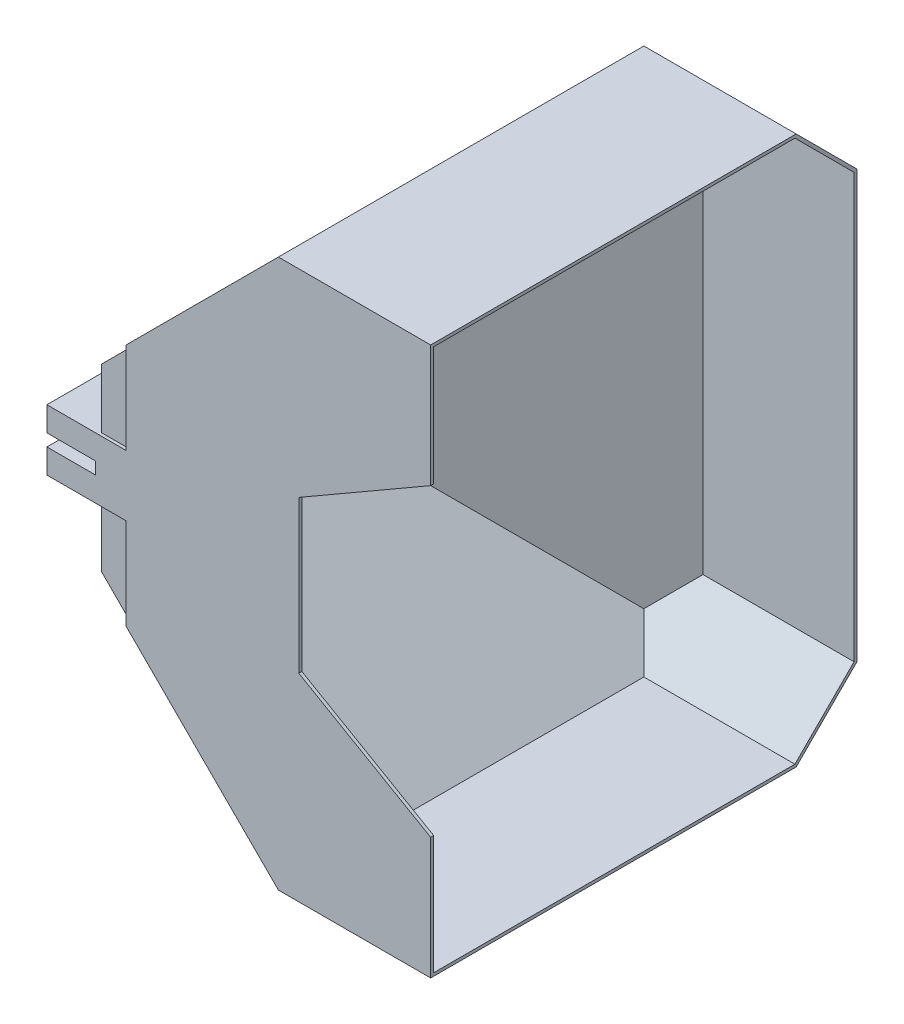
ISO-10303-21;
HEADER;
FILE_DESCRIPTION(('STEP AP214'),'2;1');
FILE_NAME('part.step','',(''),(''),'','','');
FILE_SCHEMA(('AUTOMOTIVE_DESIGN { 1 0 10303 214 1 1 1 1 }'));
ENDSEC;
DATA;
#1=APPLICATION_CONTEXT('core data for automotive mechanical design processes');
#2=APPLICATION_PROTOCOL_DEFINITION('international standard','automotive_design',2000,#1);
#3=PRODUCT_CONTEXT('',#1,'mechanical');
#4=PRODUCT('Part','Part','',(#3));
#5=PRODUCT_RELATED_PRODUCT_CATEGORY('part','',(#4));
#6=PRODUCT_DEFINITION_FORMATION('','',#4);
#7=PRODUCT_DEFINITION_CONTEXT('part definition',#1,'design');
#8=PRODUCT_DEFINITION('design','',#6,#7);
#9=PRODUCT_DEFINITION_SHAPE('','',#8);
#10=(LENGTH_UNIT() NAMED_UNIT(*) SI_UNIT(.MILLI.,.METRE.));
#11=(NAMED_UNIT(*) PLANE_ANGLE_UNIT() SI_UNIT($,.RADIAN.));
#12=(NAMED_UNIT(*) SI_UNIT($,.STERADIAN.) SOLID_ANGLE_UNIT());
#13=UNCERTAINTY_MEASURE_WITH_UNIT(LENGTH_MEASURE(1.E-05),#10,'distance_accuracy_value','');
#14=(GEOMETRIC_REPRESENTATION_CONTEXT(3) GLOBAL_UNCERTAINTY_ASSIGNED_CONTEXT((#13)) GLOBAL_UNIT_ASSIGNED_CONTEXT((#10,
#11,#12)) REPRESENTATION_CONTEXT('',''));
#15=CARTESIAN_POINT('',(0.,0.,0.));
#16=DIRECTION('',(0.,0.,1.));
#17=DIRECTION('',(1.,0.,0.));
#18=AXIS2_PLACEMENT_3D('',#15,#16,#17);
#19=CARTESIAN_POINT('',(-35.5,0.,0.));
#20=DIRECTION('',(-1.,0.,0.));
#21=DIRECTION('',(0.,0.,1.));
#22=AXIS2_PLACEMENT_3D('',#19,#20,#21);
#23=PLANE('',#22);
#24=DIRECTION('',(0.,0.,-1.));
#25=VECTOR('',#24,1.);
#26=CARTESIAN_POINT('',(-35.5,46.,50.));
#27=LINE('',#26,#25);
#28=CARTESIAN_POINT('',(-35.5,46.,35.));
#29=VERTEX_POINT('',#28);
#30=CARTESIAN_POINT('',(-35.5,46.,20.));
#31=VERTEX_POINT('',#30);
#32=EDGE_CURVE('E626',#29,#31,#27,.T.);
#33=ORIENTED_EDGE('',*,*,#32,.F.);
#34=DIRECTION('',(0.,1.,0.));
#35=VECTOR('',#34,1.);
#36=CARTESIAN_POINT('',(-35.5,0.,35.));
#37=LINE('',#36,#35);
#38=CARTESIAN_POINT('',(-35.5,50.,35.));
#39=VERTEX_POINT('',#38);
#40=EDGE_CURVE('E666',#29,#39,#37,.T.);
#41=ORIENTED_EDGE('',*,*,#40,.T.);
#42=DIRECTION('',(0.,0.,1.));
#43=VECTOR('',#42,1.);
#44=CARTESIAN_POINT('',(-35.5,50.,0.));
#45=LINE('',#44,#43);
#46=CARTESIAN_POINT('',(-35.5,50.,20.));
#47=VERTEX_POINT('',#46);
#48=EDGE_CURVE('E656',#47,#39,#45,.T.);
#49=ORIENTED_EDGE('',*,*,#48,.F.);
#50=DIRECTION('',(0.,1.,0.));
#51=VECTOR('',#50,1.);
#52=CARTESIAN_POINT('',(-35.5,0.,20.));
#53=LINE('',#52,#51);
#54=EDGE_CURVE('E381',#47,#31,#53,.F.);
#55=ORIENTED_EDGE('',*,*,#54,.T.);
#56=EDGE_LOOP('',(#33,#41,#49,#55));
#57=FACE_BOUND('',#56,.T.);
#58=ADVANCED_FACE('F47',(#57),#23,.T.);
#59=CARTESIAN_POINT('',(27.5,90.,-35.));
#60=DIRECTION('',(-1.,0.,0.));
#61=DIRECTION('',(0.,0.,1.));
#62=AXIS2_PLACEMENT_3D('',#59,#60,#61);
#63=PLANE('',#62);
#64=DIRECTION('',(0.,-1.,0.));
#65=VECTOR('',#64,1.);
#66=CARTESIAN_POINT('',(27.5,90.,34.5));
#67=LINE('',#66,#65);
#68=CARTESIAN_POINT('',(27.5,20.,34.5));
#69=VERTEX_POINT('',#68);
#70=CARTESIAN_POINT('',(27.5,0.5,34.5));
#71=VERTEX_POINT('',#70);
#72=EDGE_CURVE('E282',#69,#71,#67,.T.);
#73=ORIENTED_EDGE('',*,*,#72,.F.);
#74=DIRECTION('',(0.,0.,-1.));
#75=VECTOR('',#74,1.);
#76=CARTESIAN_POINT('',(27.5,20.,39.5));
#77=LINE('',#76,#75);
#78=CARTESIAN_POINT('',(27.5,20.,35.));
#79=VERTEX_POINT('',#78);
#80=EDGE_CURVE('E64',#79,#69,#77,.T.);
#81=ORIENTED_EDGE('',*,*,#80,.F.);
#82=DIRECTION('',(0.,-1.,0.));
#83=VECTOR('',#82,1.);
#84=CARTESIAN_POINT('',(27.5,90.,35.));
#85=LINE('',#84,#83);
#86=CARTESIAN_POINT('',(27.5,0.,35.));
#87=VERTEX_POINT('',#86);
#88=EDGE_CURVE('E279',#79,#87,#85,.T.);
#89=ORIENTED_EDGE('',*,*,#88,.T.);
#90=DIRECTION('',(0.,0.,-1.));
#91=VECTOR('',#90,1.);
#92=CARTESIAN_POINT('',(27.5,0.,-35.));
#93=LINE('',#92,#91);
#94=CARTESIAN_POINT('',(27.5,0.,-25.));
#95=VERTEX_POINT('',#94);
#96=EDGE_CURVE('E467',#87,#95,#93,.T.);
#97=ORIENTED_EDGE('',*,*,#96,.T.);
#98=DIRECTION('',(0.,-0.707106781186547,0.707106781186548));
#99=VECTOR('',#98,1.);
#100=CARTESIAN_POINT('',(27.5,10.,-35.));
#101=LINE('',#100,#99);
#102=CARTESIAN_POINT('',(27.5,10.,-35.));
#103=VERTEX_POINT('',#102);
#104=EDGE_CURVE('E361',#95,#103,#101,.F.);
#105=ORIENTED_EDGE('',*,*,#104,.T.);
#106=DIRECTION('',(0.,-1.,0.));
#107=VECTOR('',#106,1.);
#108=CARTESIAN_POINT('',(27.5,90.,-35.));
#109=LINE('',#108,#107);
#110=CARTESIAN_POINT('',(27.5,80.,-35.));
#111=VERTEX_POINT('',#110);
#112=EDGE_CURVE('E297',#111,#103,#109,.T.);
#113=ORIENTED_EDGE('',*,*,#112,.F.);
#114=DIRECTION('',(0.,0.707106781186548,0.707106781186547));
#115=VECTOR('',#114,1.);
#116=CARTESIAN_POINT('',(27.5,90.,-25.));
#117=LINE('',#116,#115);
#118=CARTESIAN_POINT('',(27.5,90.,-25.));
#119=VERTEX_POINT('',#118);
#120=EDGE_CURVE('E364',#111,#119,#117,.T.);
#121=ORIENTED_EDGE('',*,*,#120,.T.);
#122=DIRECTION('',(0.,0.,-1.));
#123=VECTOR('',#122,1.);
#124=CARTESIAN_POINT('',(27.5,90.,-35.));
#125=LINE('',#124,#123);
#126=CARTESIAN_POINT('',(27.5,90.,35.));
#127=VERTEX_POINT('',#126);
#128=EDGE_CURVE('E298',#127,#119,#125,.T.);
#129=ORIENTED_EDGE('',*,*,#128,.F.);
#130=CARTESIAN_POINT('',(27.5,70.,35.));
#131=VERTEX_POINT('',#130);
#132=EDGE_CURVE('E291',#127,#131,#85,.T.);
#133=ORIENTED_EDGE('',*,*,#132,.T.);
#134=DIRECTION('',(0.,0.,-1.));
#135=VECTOR('',#134,1.);
#136=CARTESIAN_POINT('',(27.5,70.,39.5));
#137=LINE('',#136,#135);
#138=CARTESIAN_POINT('',(27.5,70.,34.5));
#139=VERTEX_POINT('',#138);
#140=EDGE_CURVE('E284',#131,#139,#137,.T.);
#141=ORIENTED_EDGE('',*,*,#140,.T.);
#142=CARTESIAN_POINT('',(27.5,89.5,34.5));
#143=VERTEX_POINT('',#142);
#144=EDGE_CURVE('E437',#143,#139,#67,.T.);
#145=ORIENTED_EDGE('',*,*,#144,.F.);
#146=DIRECTION('',(0.,0.,-1.));
#147=VECTOR('',#146,1.);
#148=CARTESIAN_POINT('',(27.5,89.5,-35.));
#149=LINE('',#148,#147);
#150=CARTESIAN_POINT('',(27.5,89.5,-24.7928932188135));
#151=VERTEX_POINT('',#150);
#152=EDGE_CURVE('E453',#143,#151,#149,.T.);
#153=ORIENTED_EDGE('',*,*,#152,.T.);
#154=DIRECTION('',(0.,0.707106781186548,0.707106781186547));
#155=VECTOR('',#154,1.);
#156=CARTESIAN_POINT('',(27.5,89.6464466094067,-24.6464466094067));
#157=LINE('',#156,#155);
#158=CARTESIAN_POINT('',(27.5,79.7928932188134,-34.5));
#159=VERTEX_POINT('',#158);
#160=EDGE_CURVE('E463',#159,#151,#157,.T.);
#161=ORIENTED_EDGE('',*,*,#160,.F.);
#162=DIRECTION('',(0.,-1.,0.));
#163=VECTOR('',#162,1.);
#164=CARTESIAN_POINT('',(27.5,90.,-34.5));
#165=LINE('',#164,#163);
#166=CARTESIAN_POINT('',(27.5,10.2071067811865,-34.5));
#167=VERTEX_POINT('',#166);
#168=EDGE_CURVE('E449',#159,#167,#165,.T.);
#169=ORIENTED_EDGE('',*,*,#168,.T.);
#170=DIRECTION('',(0.,-0.707106781186547,0.707106781186548));
#171=VECTOR('',#170,1.);
#172=CARTESIAN_POINT('',(27.5,10.3535533905933,-34.6464466094067));
#173=LINE('',#172,#171);
#174=CARTESIAN_POINT('',(27.5,0.5,-24.7928932188134));
#175=VERTEX_POINT('',#174);
#176=EDGE_CURVE('E460',#175,#167,#173,.F.);
#177=ORIENTED_EDGE('',*,*,#176,.F.);
#178=DIRECTION('',(0.,0.,-1.));
#179=VECTOR('',#178,1.);
#180=CARTESIAN_POINT('',(27.5,0.5,-35.));
#181=LINE('',#180,#179);
#182=EDGE_CURVE('E455',#71,#175,#181,.T.);
#183=ORIENTED_EDGE('',*,*,#182,.F.);
#184=EDGE_LOOP('',(#73,#81,#89,#97,#105,#113,#121,#129,#133,#141,#145,#153,#161,#169,#177,#183));
#185=FACE_BOUND('',#184,.T.);
#186=ADVANCED_FACE('F277',(#185),#63,.F.);
#187=CARTESIAN_POINT('',(-27.5,90.,-35.));
#188=DIRECTION('',(0.,0.,1.));
#189=DIRECTION('',(1.,0.,0.));
#190=AXIS2_PLACEMENT_3D('',#187,#188,#189);
#191=PLANE('',#190);
#192=DIRECTION('',(0.,1.,0.));
#193=VECTOR('',#192,1.);
#194=CARTESIAN_POINT('',(2.50000000000008,90.,-35.));
#195=LINE('',#194,#193);
#196=CARTESIAN_POINT('',(2.50000000000008,9.99999999999999,-35.));
#197=VERTEX_POINT('',#196);
#198=CARTESIAN_POINT('',(2.50000000000008,80.,-35.));
#199=VERTEX_POINT('',#198);
#200=EDGE_CURVE('E310',#197,#199,#195,.T.);
#201=ORIENTED_EDGE('',*,*,#200,.T.);
#202=DIRECTION('',(1.,0.,0.));
#203=VECTOR('',#202,1.);
#204=CARTESIAN_POINT('',(27.5,80.,-35.));
#205=LINE('',#204,#203);
#206=EDGE_CURVE('E358',#199,#111,#205,.T.);
#207=ORIENTED_EDGE('',*,*,#206,.T.);
#208=ORIENTED_EDGE('',*,*,#112,.T.);
#209=DIRECTION('',(-1.,0.,0.));
#210=VECTOR('',#209,1.);
#211=CARTESIAN_POINT('',(-27.5,9.99999999999999,-35.));
#212=LINE('',#211,#210);
#213=EDGE_CURVE('E354',#103,#197,#212,.T.);
#214=ORIENTED_EDGE('',*,*,#213,.T.);
#215=EDGE_LOOP('',(#201,#207,#208,#214));
#216=FACE_BOUND('',#215,.T.);
#217=ADVANCED_FACE('F598',(#216),#191,.F.);
#218=CARTESIAN_POINT('',(-27.5,90.,-35.));
#219=DIRECTION('',(1.,0.,0.));
#220=DIRECTION('',(0.,0.,-1.));
#221=AXIS2_PLACEMENT_3D('',#218,#219,#220);
#222=PLANE('',#221);
#223=DIRECTION('',(0.,0.,1.));
#224=VECTOR('',#223,1.);
#225=CARTESIAN_POINT('',(-27.5,30.,-35.));
#226=LINE('',#225,#224);
#227=CARTESIAN_POINT('',(-27.5,30.,-5.00000000000002));
#228=VERTEX_POINT('',#227);
#229=CARTESIAN_POINT('',(-27.5,30.,29.9999999999999));
#230=VERTEX_POINT('',#229);
#231=EDGE_CURVE('E317',#228,#230,#226,.T.);
#232=ORIENTED_EDGE('',*,*,#231,.T.);
#233=DIRECTION('',(0.,1.,0.));
#234=VECTOR('',#233,1.);
#235=CARTESIAN_POINT('',(-27.5,90.,29.9999999999999));
#236=LINE('',#235,#234);
#237=CARTESIAN_POINT('',(-27.5,40.,29.9999999999999));
#238=VERTEX_POINT('',#237);
#239=EDGE_CURVE('E72',#230,#238,#236,.T.);
#240=ORIENTED_EDGE('',*,*,#239,.T.);
#241=DIRECTION('',(0.,0.,1.));
#242=VECTOR('',#241,1.);
#243=CARTESIAN_POINT('',(-27.5,40.,0.));
#244=LINE('',#243,#242);
#245=CARTESIAN_POINT('',(-27.5,40.,15.));
#246=VERTEX_POINT('',#245);
#247=EDGE_CURVE('E653',#246,#238,#244,.T.);
#248=ORIENTED_EDGE('',*,*,#247,.F.);
#249=DIRECTION('',(0.,1.,0.));
#250=VECTOR('',#249,1.);
#251=CARTESIAN_POINT('',(-27.5,0.,15.));
#252=LINE('',#251,#250);
#253=CARTESIAN_POINT('',(-27.5,50.,15.));
#254=VERTEX_POINT('',#253);
#255=EDGE_CURVE('E643',#246,#254,#252,.T.);
#256=ORIENTED_EDGE('',*,*,#255,.T.);
#257=DIRECTION('',(0.,0.,1.));
#258=VECTOR('',#257,1.);
#259=CARTESIAN_POINT('',(-27.5,50.,0.));
#260=LINE('',#259,#258);
#261=CARTESIAN_POINT('',(-27.5,50.,29.9999999999999));
#262=VERTEX_POINT('',#261);
#263=EDGE_CURVE('E659',#254,#262,#260,.T.);
#264=ORIENTED_EDGE('',*,*,#263,.T.);
#265=DIRECTION('',(0.,1.,0.));
#266=VECTOR('',#265,1.);
#267=CARTESIAN_POINT('',(-27.5,90.,29.9999999999999));
#268=LINE('',#267,#266);
#269=CARTESIAN_POINT('',(-27.5,59.9999999999999,29.9999999999999));
#270=VERTEX_POINT('',#269);
#271=EDGE_CURVE('E402',#262,#270,#268,.T.);
#272=ORIENTED_EDGE('',*,*,#271,.T.);
#273=DIRECTION('',(0.,0.,-1.));
#274=VECTOR('',#273,1.);
#275=CARTESIAN_POINT('',(-27.5,59.9999999999999,-5.00000000000001));
#276=LINE('',#275,#274);
#277=CARTESIAN_POINT('',(-27.5,59.9999999999999,-5.00000000000002));
#278=VERTEX_POINT('',#277);
#279=EDGE_CURVE('E314',#270,#278,#276,.T.);
#280=ORIENTED_EDGE('',*,*,#279,.T.);
#281=DIRECTION('',(0.,-1.,0.));
#282=VECTOR('',#281,1.);
#283=CARTESIAN_POINT('',(-27.5,90.,-5.00000000000002));
#284=LINE('',#283,#282);
#285=EDGE_CURVE('E306',#278,#228,#284,.T.);
#286=ORIENTED_EDGE('',*,*,#285,.T.);
#287=EDGE_LOOP('',(#232,#240,#248,#256,#264,#272,#280,#286));
#288=FACE_BOUND('',#287,.T.);
#289=ADVANCED_FACE('F721',(#288),#222,.F.);
#290=CARTESIAN_POINT('',(-27.5,90.,35.));
#291=DIRECTION('',(0.,0.,-1.));
#292=DIRECTION('',(-1.,0.,0.));
#293=AXIS2_PLACEMENT_3D('',#290,#291,#292);
#294=PLANE('',#293);
#295=DIRECTION('',(0.,1.,0.));
#296=VECTOR('',#295,1.);
#297=CARTESIAN_POINT('',(5.84936490538906,90.,35.));
#298=LINE('',#297,#296);
#299=CARTESIAN_POINT('',(5.84936490538906,32.5,35.));
#300=VERTEX_POINT('',#299);
#301=CARTESIAN_POINT('',(5.84936490538906,57.5,35.));
#302=VERTEX_POINT('',#301);
#303=EDGE_CURVE('E272',#300,#302,#298,.T.);
#304=ORIENTED_EDGE('',*,*,#303,.T.);
#305=DIRECTION('',(0.866025403784439,0.5,0.));
#306=VECTOR('',#305,1.);
#307=CARTESIAN_POINT('',(-5.08974596215563,51.1843013959279,35.));
#308=LINE('',#307,#306);
#309=EDGE_CURVE('E431',#302,#131,#308,.T.);
#310=ORIENTED_EDGE('',*,*,#309,.T.);
#311=ORIENTED_EDGE('',*,*,#132,.F.);
#312=DIRECTION('',(1.,0.,0.));
#313=VECTOR('',#312,1.);
#314=CARTESIAN_POINT('',(-27.5,90.,35.));
#315=LINE('',#314,#313);
#316=CARTESIAN_POINT('',(2.49999999999998,90.,35.));
#317=VERTEX_POINT('',#316);
#318=EDGE_CURVE('E292',#317,#127,#315,.T.);
#319=ORIENTED_EDGE('',*,*,#318,.F.);
#320=DIRECTION('',(-0.707106781186546,-0.707106781186549,0.));
#321=VECTOR('',#320,1.);
#322=CARTESIAN_POINT('',(2.49999999999998,90.,35.));
#323=LINE('',#322,#321);
#324=CARTESIAN_POINT('',(-22.4999999999999,65.,35.));
#325=VERTEX_POINT('',#324);
#326=EDGE_CURVE('E320',#317,#325,#323,.T.);
#327=ORIENTED_EDGE('',*,*,#326,.T.);
#328=DIRECTION('',(0.,-1.,0.));
#329=VECTOR('',#328,1.);
#330=CARTESIAN_POINT('',(-22.4999999999999,90.,35.));
#331=LINE('',#330,#329);
#332=CARTESIAN_POINT('',(-22.4999999999999,50.,35.));
#333=VERTEX_POINT('',#332);
#334=EDGE_CURVE('E391',#325,#333,#331,.T.);
#335=ORIENTED_EDGE('',*,*,#334,.T.);
#336=DIRECTION('',(1.,0.,0.));
#337=VECTOR('',#336,1.);
#338=CARTESIAN_POINT('',(-35.5,50.,35.));
#339=LINE('',#338,#337);
#340=EDGE_CURVE('E648',#39,#333,#339,.T.);
#341=ORIENTED_EDGE('',*,*,#340,.F.);
#342=ORIENTED_EDGE('',*,*,#40,.F.);
#343=DIRECTION('',(1.,0.,0.));
#344=VECTOR('',#343,1.);
#345=CARTESIAN_POINT('',(-27.5,46.,35.));
#346=LINE('',#345,#344);
#347=CARTESIAN_POINT('',(-27.5,46.,35.));
#348=VERTEX_POINT('',#347);
#349=EDGE_CURVE('E663',#29,#348,#346,.T.);
#350=ORIENTED_EDGE('',*,*,#349,.T.);
#351=DIRECTION('',(0.,1.,0.));
#352=VECTOR('',#351,1.);
#353=CARTESIAN_POINT('',(-27.5,90.,35.));
#354=LINE('',#353,#352);
#355=CARTESIAN_POINT('',(-27.5,44.,35.));
#356=VERTEX_POINT('',#355);
#357=EDGE_CURVE('E388',#356,#348,#354,.T.);
#358=ORIENTED_EDGE('',*,*,#357,.F.);
#359=DIRECTION('',(-1.,0.,0.));
#360=VECTOR('',#359,1.);
#361=CARTESIAN_POINT('',(-27.5,44.,35.));
#362=LINE('',#361,#360);
#363=CARTESIAN_POINT('',(-35.5,44.,35.));
#364=VERTEX_POINT('',#363);
#365=EDGE_CURVE('E675',#356,#364,#362,.T.);
#366=ORIENTED_EDGE('',*,*,#365,.T.);
#367=CARTESIAN_POINT('',(-35.5,40.,35.));
#368=VERTEX_POINT('',#367);
#369=EDGE_CURVE('E622',#368,#364,#37,.T.);
#370=ORIENTED_EDGE('',*,*,#369,.F.);
#371=DIRECTION('',(1.,0.,0.));
#372=VECTOR('',#371,1.);
#373=CARTESIAN_POINT('',(-35.5,40.,35.));
#374=LINE('',#373,#372);
#375=CARTESIAN_POINT('',(-22.4999999999999,40.,35.));
#376=VERTEX_POINT('',#375);
#377=EDGE_CURVE('E645',#368,#376,#374,.T.);
#378=ORIENTED_EDGE('',*,*,#377,.T.);
#379=DIRECTION('',(0.,-1.,0.));
#380=VECTOR('',#379,1.);
#381=CARTESIAN_POINT('',(-22.4999999999999,90.,35.));
#382=LINE('',#381,#380);
#383=CARTESIAN_POINT('',(-22.4999999999999,25.,35.));
#384=VERTEX_POINT('',#383);
#385=EDGE_CURVE('E395',#376,#384,#382,.T.);
#386=ORIENTED_EDGE('',*,*,#385,.T.);
#387=DIRECTION('',(-0.707106781186549,0.707106781186547,0.));
#388=VECTOR('',#387,1.);
#389=CARTESIAN_POINT('',(-27.5,30.,35.));
#390=LINE('',#389,#388);
#391=CARTESIAN_POINT('',(2.50000000000009,0.,35.));
#392=VERTEX_POINT('',#391);
#393=EDGE_CURVE('E324',#384,#392,#390,.F.);
#394=ORIENTED_EDGE('',*,*,#393,.T.);
#395=DIRECTION('',(1.,0.,0.));
#396=VECTOR('',#395,1.);
#397=CARTESIAN_POINT('',(-27.5,0.,35.));
#398=LINE('',#397,#396);
#399=EDGE_CURVE('E288',#392,#87,#398,.T.);
#400=ORIENTED_EDGE('',*,*,#399,.T.);
#401=ORIENTED_EDGE('',*,*,#88,.F.);
#402=DIRECTION('',(-0.866025403784439,0.5,0.));
#403=VECTOR('',#402,1.);
#404=CARTESIAN_POINT('',(-44.0608891324553,61.3156986040721,35.));
#405=LINE('',#404,#403);
#406=EDGE_CURVE('E264',#79,#300,#405,.T.);
#407=ORIENTED_EDGE('',*,*,#406,.T.);
#408=EDGE_LOOP('',(#304,#310,#311,#319,#327,#335,#341,#342,#350,#358,#366,#370,#378,#386,#394,
#400,#401,#407));
#409=FACE_BOUND('',#408,.T.);
#410=ADVANCED_FACE('F286',(#409),#294,.F.);
#411=CARTESIAN_POINT('',(0.,90.,0.));
#412=DIRECTION('',(0.,1.,0.));
#413=DIRECTION('',(0.,0.,1.));
#414=AXIS2_PLACEMENT_3D('',#411,#412,#413);
#415=PLANE('',#414);
#416=ORIENTED_EDGE('',*,*,#128,.T.);
#417=DIRECTION('',(-1.,0.,0.));
#418=VECTOR('',#417,1.);
#419=CARTESIAN_POINT('',(2.50000000000008,90.,-25.));
#420=LINE('',#419,#418);
#421=CARTESIAN_POINT('',(2.49999999999997,90.,-25.));
#422=VERTEX_POINT('',#421);
#423=EDGE_CURVE('E341',#119,#422,#420,.T.);
#424=ORIENTED_EDGE('',*,*,#423,.T.);
#425=DIRECTION('',(0.,0.,1.));
#426=VECTOR('',#425,1.);
#427=CARTESIAN_POINT('',(2.49999999999998,90.,35.));
#428=LINE('',#427,#426);
#429=EDGE_CURVE('E338',#422,#317,#428,.T.);
#430=ORIENTED_EDGE('',*,*,#429,.T.);
#431=ORIENTED_EDGE('',*,*,#318,.T.);
#432=EDGE_LOOP('',(#416,#424,#430,#431));
#433=FACE_BOUND('',#432,.T.);
#434=ADVANCED_FACE('F748',(#433),#415,.T.);
#435=CARTESIAN_POINT('',(0.,0.,0.));
#436=DIRECTION('',(0.,1.,0.));
#437=DIRECTION('',(0.,0.,1.));
#438=AXIS2_PLACEMENT_3D('',#435,#436,#437);
#439=PLANE('',#438);
#440=DIRECTION('',(0.,0.,-1.));
#441=VECTOR('',#440,1.);
#442=CARTESIAN_POINT('',(2.50000000000008,0.,0.));
#443=LINE('',#442,#441);
#444=CARTESIAN_POINT('',(2.50000000000008,0.,-25.));
#445=VERTEX_POINT('',#444);
#446=EDGE_CURVE('E327',#392,#445,#443,.T.);
#447=ORIENTED_EDGE('',*,*,#446,.T.);
#448=DIRECTION('',(1.,0.,0.));
#449=VECTOR('',#448,1.);
#450=CARTESIAN_POINT('',(0.,0.,-25.));
#451=LINE('',#450,#449);
#452=EDGE_CURVE('E370',#445,#95,#451,.T.);
#453=ORIENTED_EDGE('',*,*,#452,.T.);
#454=ORIENTED_EDGE('',*,*,#96,.F.);
#455=ORIENTED_EDGE('',*,*,#399,.F.);
#456=EDGE_LOOP('',(#447,#453,#454,#455));
#457=FACE_BOUND('',#456,.T.);
#458=ADVANCED_FACE('F736',(#457),#439,.F.);
#459=CARTESIAN_POINT('',(-27.5,90.,-5.00000000000002));
#460=DIRECTION('',(0.707106781186546,0.,0.707106781186549));
#461=DIRECTION('',(0.,-1.,0.));
#462=AXIS2_PLACEMENT_3D('',#459,#460,#461);
#463=PLANE('',#462);
#464=DIRECTION('',(-0.577350269189626,-0.577350269189628,0.577350269189624));
#465=VECTOR('',#464,1.);
#466=CARTESIAN_POINT('',(-17.4999999999999,70.,-15.));
#467=LINE('',#466,#465);
#468=CARTESIAN_POINT('',(-2.49999999999998,85.,-29.9999999999999));
#469=VERTEX_POINT('',#468);
#470=EDGE_CURVE('E331',#278,#469,#467,.F.);
#471=ORIENTED_EDGE('',*,*,#470,.T.);
#472=DIRECTION('',(-0.577350269189627,0.577350269189626,0.577350269189625));
#473=VECTOR('',#472,1.);
#474=CARTESIAN_POINT('',(-20.8333333333333,103.333333333333,-11.6666666666667));
#475=LINE('',#474,#473);
#476=EDGE_CURVE('E351',#469,#199,#475,.F.);
#477=ORIENTED_EDGE('',*,*,#476,.T.);
#478=ORIENTED_EDGE('',*,*,#200,.F.);
#479=DIRECTION('',(-0.577350269189627,-0.577350269189625,0.577350269189625));
#480=VECTOR('',#479,1.);
#481=CARTESIAN_POINT('',(9.16666666666668,16.6666666666666,-41.6666666666666));
#482=LINE('',#481,#480);
#483=CARTESIAN_POINT('',(-2.49999999999994,5.00000000000002,-30.));
#484=VERTEX_POINT('',#483);
#485=EDGE_CURVE('E348',#197,#484,#482,.T.);
#486=ORIENTED_EDGE('',*,*,#485,.T.);
#487=DIRECTION('',(-0.577350269189627,0.577350269189625,0.577350269189625));
#488=VECTOR('',#487,1.);
#489=CARTESIAN_POINT('',(-47.5,50.,14.9999999999999));
#490=LINE('',#489,#488);
#491=EDGE_CURVE('E335',#484,#228,#490,.T.);
#492=ORIENTED_EDGE('',*,*,#491,.T.);
#493=ORIENTED_EDGE('',*,*,#285,.F.);
#494=EDGE_LOOP('',(#471,#477,#478,#486,#492,#493));
#495=FACE_BOUND('',#494,.T.);
#496=ADVANCED_FACE('F756',(#495),#463,.F.);
#497=CARTESIAN_POINT('',(-27.5,30.,-35.));
#498=DIRECTION('',(0.707106781186547,0.707106781186549,0.));
#499=DIRECTION('',(0.,0.,1.));
#500=AXIS2_PLACEMENT_3D('',#497,#498,#499);
#501=PLANE('',#500);
#502=ORIENTED_EDGE('',*,*,#393,.F.);
#503=DIRECTION('',(-0.577350269189625,0.577350269189624,-0.577350269189629));
#504=VECTOR('',#503,1.);
#505=CARTESIAN_POINT('',(-49.1666666666667,51.6666666666667,8.33333333333309));
#506=LINE('',#505,#504);
#507=EDGE_CURVE('E399',#384,#230,#506,.T.);
#508=ORIENTED_EDGE('',*,*,#507,.T.);
#509=ORIENTED_EDGE('',*,*,#231,.F.);
#510=ORIENTED_EDGE('',*,*,#491,.F.);
#511=DIRECTION('',(0.577350269189627,-0.577350269189625,0.577350269189626));
#512=VECTOR('',#511,1.);
#513=CARTESIAN_POINT('',(-20.8333333333333,23.3333333333333,-48.3333333333333));
#514=LINE('',#513,#512);
#515=EDGE_CURVE('E367',#484,#445,#514,.T.);
#516=ORIENTED_EDGE('',*,*,#515,.T.);
#517=ORIENTED_EDGE('',*,*,#446,.F.);
#518=EDGE_LOOP('',(#502,#508,#509,#510,#516,#517));
#519=FACE_BOUND('',#518,.T.);
#520=ADVANCED_FACE('F730',(#519),#501,.F.);
#521=CARTESIAN_POINT('',(2.49999999999998,90.,0.));
#522=DIRECTION('',(-0.707106781186549,0.707106781186546,0.));
#523=DIRECTION('',(0.,0.,-1.));
#524=AXIS2_PLACEMENT_3D('',#521,#522,#523);
#525=PLANE('',#524);
#526=ORIENTED_EDGE('',*,*,#279,.F.);
#527=DIRECTION('',(-0.577350269189624,-0.577350269189626,-0.577350269189627));
#528=VECTOR('',#527,1.);
#529=CARTESIAN_POINT('',(-17.5,69.9999999999999,39.9999999999999));
#530=LINE('',#529,#528);
#531=EDGE_CURVE('E407',#270,#325,#530,.F.);
#532=ORIENTED_EDGE('',*,*,#531,.T.);
#533=ORIENTED_EDGE('',*,*,#326,.F.);
#534=ORIENTED_EDGE('',*,*,#429,.F.);
#535=DIRECTION('',(-0.577350269189625,-0.577350269189627,-0.577350269189626));
#536=VECTOR('',#535,1.);
#537=CARTESIAN_POINT('',(10.8333333333333,98.3333333333333,-16.6666666666667));
#538=LINE('',#537,#536);
#539=EDGE_CURVE('E345',#422,#469,#538,.T.);
#540=ORIENTED_EDGE('',*,*,#539,.T.);
#541=ORIENTED_EDGE('',*,*,#470,.F.);
#542=EDGE_LOOP('',(#526,#532,#533,#534,#540,#541));
#543=FACE_BOUND('',#542,.T.);
#544=ADVANCED_FACE('F752',(#543),#525,.T.);
#545=CARTESIAN_POINT('',(0.,90.,-25.));
#546=DIRECTION('',(0.,0.707106781186547,-0.707106781186548));
#547=DIRECTION('',(1.,0.,0.));
#548=AXIS2_PLACEMENT_3D('',#545,#546,#547);
#549=PLANE('',#548);
#550=ORIENTED_EDGE('',*,*,#120,.F.);
#551=ORIENTED_EDGE('',*,*,#206,.F.);
#552=ORIENTED_EDGE('',*,*,#476,.F.);
#553=ORIENTED_EDGE('',*,*,#539,.F.);
#554=ORIENTED_EDGE('',*,*,#423,.F.);
#555=EDGE_LOOP('',(#550,#551,#552,#553,#554));
#556=FACE_BOUND('',#555,.T.);
#557=ADVANCED_FACE('F587',(#556),#549,.T.);
#558=CARTESIAN_POINT('',(-27.5,9.99999999999999,-35.));
#559=DIRECTION('',(0.,0.707106781186548,0.707106781186547));
#560=DIRECTION('',(-1.,0.,0.));
#561=AXIS2_PLACEMENT_3D('',#558,#559,#560);
#562=PLANE('',#561);
#563=ORIENTED_EDGE('',*,*,#104,.F.);
#564=ORIENTED_EDGE('',*,*,#452,.F.);
#565=ORIENTED_EDGE('',*,*,#515,.F.);
#566=ORIENTED_EDGE('',*,*,#485,.F.);
#567=ORIENTED_EDGE('',*,*,#213,.F.);
#568=EDGE_LOOP('',(#563,#564,#565,#566,#567));
#569=FACE_BOUND('',#568,.T.);
#570=ADVANCED_FACE('F579',(#569),#562,.F.);
#571=CARTESIAN_POINT('',(-27.5,90.,-34.5));
#572=DIRECTION('',(0.,0.,1.));
#573=DIRECTION('',(1.,0.,0.));
#574=AXIS2_PLACEMENT_3D('',#571,#572,#573);
#575=PLANE('',#574);
#576=DIRECTION('',(0.,-1.,0.));
#577=VECTOR('',#576,1.);
#578=CARTESIAN_POINT('',(2.70710678118662,90.,-34.5));
#579=LINE('',#578,#577);
#580=CARTESIAN_POINT('',(2.70710678118662,10.2071067811865,-34.5));
#581=VERTEX_POINT('',#580);
#582=CARTESIAN_POINT('',(2.70710678118662,79.7928932188134,-34.5));
#583=VERTEX_POINT('',#582);
#584=EDGE_CURVE('E542',#581,#583,#579,.F.);
#585=ORIENTED_EDGE('',*,*,#584,.F.);
#586=DIRECTION('',(1.,0.,0.));
#587=VECTOR('',#586,1.);
#588=CARTESIAN_POINT('',(-27.5,10.2071067811865,-34.5));
#589=LINE('',#588,#587);
#590=EDGE_CURVE('E532',#167,#581,#589,.F.);
#591=ORIENTED_EDGE('',*,*,#590,.F.);
#592=ORIENTED_EDGE('',*,*,#168,.F.);
#593=DIRECTION('',(1.,0.,0.));
#594=VECTOR('',#593,1.);
#595=CARTESIAN_POINT('',(0.,79.7928932188134,-34.5));
#596=LINE('',#595,#594);
#597=EDGE_CURVE('E464',#583,#159,#596,.T.);
#598=ORIENTED_EDGE('',*,*,#597,.F.);
#599=EDGE_LOOP('',(#585,#591,#592,#598));
#600=FACE_BOUND('',#599,.T.);
#601=ADVANCED_FACE('F576',(#600),#575,.T.);
#602=CARTESIAN_POINT('',(-27.,90.,-35.));
#603=DIRECTION('',(1.,0.,0.));
#604=DIRECTION('',(0.,0.,-1.));
#605=AXIS2_PLACEMENT_3D('',#602,#603,#604);
#606=PLANE('',#605);
#607=DIRECTION('',(0.,1.,0.));
#608=VECTOR('',#607,1.);
#609=CARTESIAN_POINT('',(-27.,90.,-4.79289321881347));
#610=LINE('',#609,#608);
#611=CARTESIAN_POINT('',(-27.,59.7928932188134,-4.79289321881347));
#612=VERTEX_POINT('',#611);
#613=CARTESIAN_POINT('',(-27.,30.2071067811865,-4.79289321881347));
#614=VERTEX_POINT('',#613);
#615=EDGE_CURVE('E487',#612,#614,#610,.F.);
#616=ORIENTED_EDGE('',*,*,#615,.F.);
#617=DIRECTION('',(0.,0.,-1.));
#618=VECTOR('',#617,1.);
#619=CARTESIAN_POINT('',(-27.,59.7928932188134,0.));
#620=LINE('',#619,#618);
#621=CARTESIAN_POINT('',(-27.,59.7928932188134,34.5));
#622=VERTEX_POINT('',#621);
#623=EDGE_CURVE('E545',#622,#612,#620,.T.);
#624=ORIENTED_EDGE('',*,*,#623,.F.);
#625=DIRECTION('',(0.,-1.,0.));
#626=VECTOR('',#625,1.);
#627=CARTESIAN_POINT('',(-27.,90.,34.5));
#628=LINE('',#627,#626);
#629=CARTESIAN_POINT('',(-27.,30.2071067811865,34.5));
#630=VERTEX_POINT('',#629);
#631=EDGE_CURVE('E444',#622,#630,#628,.T.);
#632=ORIENTED_EDGE('',*,*,#631,.T.);
#633=DIRECTION('',(0.,0.,-1.));
#634=VECTOR('',#633,1.);
#635=CARTESIAN_POINT('',(-27.,30.2071067811865,-35.));
#636=LINE('',#635,#634);
#637=EDGE_CURVE('E519',#614,#630,#636,.F.);
#638=ORIENTED_EDGE('',*,*,#637,.F.);
#639=EDGE_LOOP('',(#616,#624,#632,#638));
#640=FACE_BOUND('',#639,.T.);
#641=ADVANCED_FACE('F578',(#640),#606,.T.);
#642=CARTESIAN_POINT('',(-27.5,90.,34.5));
#643=DIRECTION('',(0.,0.,-1.));
#644=DIRECTION('',(-1.,0.,0.));
#645=AXIS2_PLACEMENT_3D('',#642,#643,#644);
#646=PLANE('',#645);
#647=DIRECTION('',(0.866025403784439,0.5,0.));
#648=VECTOR('',#647,1.);
#649=CARTESIAN_POINT('',(-5.08974596215563,51.1843013959279,34.5));
#650=LINE('',#649,#648);
#651=CARTESIAN_POINT('',(5.84936490538906,57.5,34.5));
#652=VERTEX_POINT('',#651);
#653=EDGE_CURVE('E11',#652,#139,#650,.T.);
#654=ORIENTED_EDGE('',*,*,#653,.F.);
#655=DIRECTION('',(0.,1.,0.));
#656=VECTOR('',#655,1.);
#657=CARTESIAN_POINT('',(5.84936490538906,90.,34.5));
#658=LINE('',#657,#656);
#659=CARTESIAN_POINT('',(5.84936490538906,32.5,34.5));
#660=VERTEX_POINT('',#659);
#661=EDGE_CURVE('E57',#660,#652,#658,.T.);
#662=ORIENTED_EDGE('',*,*,#661,.F.);
#663=DIRECTION('',(-0.866025403784439,0.5,0.));
#664=VECTOR('',#663,1.);
#665=CARTESIAN_POINT('',(-44.0608891324553,61.3156986040721,34.5));
#666=LINE('',#665,#664);
#667=EDGE_CURVE('E417',#69,#660,#666,.T.);
#668=ORIENTED_EDGE('',*,*,#667,.F.);
#669=ORIENTED_EDGE('',*,*,#72,.T.);
#670=DIRECTION('',(1.,0.,0.));
#671=VECTOR('',#670,1.);
#672=CARTESIAN_POINT('',(-27.5,0.5,34.5));
#673=LINE('',#672,#671);
#674=CARTESIAN_POINT('',(2.70710678118664,0.5,34.5));
#675=VERTEX_POINT('',#674);
#676=EDGE_CURVE('E458',#675,#71,#673,.T.);
#677=ORIENTED_EDGE('',*,*,#676,.F.);
#678=DIRECTION('',(-0.707106781186549,0.707106781186547,0.));
#679=VECTOR('',#678,1.);
#680=CARTESIAN_POINT('',(-27.1464466094067,30.3535533905933,34.5));
#681=LINE('',#680,#679);
#682=EDGE_CURVE('E514',#630,#675,#681,.F.);
#683=ORIENTED_EDGE('',*,*,#682,.F.);
#684=ORIENTED_EDGE('',*,*,#631,.F.);
#685=DIRECTION('',(-0.707106781186546,-0.707106781186549,0.));
#686=VECTOR('',#685,1.);
#687=CARTESIAN_POINT('',(2.85355339059326,89.6464466094067,34.5));
#688=LINE('',#687,#686);
#689=CARTESIAN_POINT('',(2.70710678118653,89.5,34.5));
#690=VERTEX_POINT('',#689);
#691=EDGE_CURVE('E517',#690,#622,#688,.T.);
#692=ORIENTED_EDGE('',*,*,#691,.F.);
#693=DIRECTION('',(1.,0.,0.));
#694=VECTOR('',#693,1.);
#695=CARTESIAN_POINT('',(-27.5,89.5,34.5));
#696=LINE('',#695,#694);
#697=EDGE_CURVE('E440',#690,#143,#696,.T.);
#698=ORIENTED_EDGE('',*,*,#697,.T.);
#699=ORIENTED_EDGE('',*,*,#144,.T.);
#700=EDGE_LOOP('',(#654,#662,#668,#669,#677,#683,#684,#692,#698,#699));
#701=FACE_BOUND('',#700,.T.);
#702=ADVANCED_FACE('F435',(#701),#646,.T.);
#703=CARTESIAN_POINT('',(0.,89.5,0.));
#704=DIRECTION('',(0.,1.,0.));
#705=DIRECTION('',(0.,0.,1.));
#706=AXIS2_PLACEMENT_3D('',#703,#704,#705);
#707=PLANE('',#706);
#708=ORIENTED_EDGE('',*,*,#152,.F.);
#709=ORIENTED_EDGE('',*,*,#697,.F.);
#710=DIRECTION('',(0.,0.,1.));
#711=VECTOR('',#710,1.);
#712=CARTESIAN_POINT('',(2.70710678118652,89.5,0.));
#713=LINE('',#712,#711);
#714=CARTESIAN_POINT('',(2.70710678118652,89.5,-24.7928932188135));
#715=VERTEX_POINT('',#714);
#716=EDGE_CURVE('E500',#715,#690,#713,.T.);
#717=ORIENTED_EDGE('',*,*,#716,.F.);
#718=DIRECTION('',(-1.,0.,0.));
#719=VECTOR('',#718,1.);
#720=CARTESIAN_POINT('',(0.,89.5,-24.7928932188135));
#721=LINE('',#720,#719);
#722=EDGE_CURVE('E494',#151,#715,#721,.T.);
#723=ORIENTED_EDGE('',*,*,#722,.F.);
#724=EDGE_LOOP('',(#708,#709,#717,#723));
#725=FACE_BOUND('',#724,.T.);
#726=ADVANCED_FACE('F499',(#725),#707,.F.);
#727=CARTESIAN_POINT('',(0.,0.5,0.));
#728=DIRECTION('',(0.,1.,0.));
#729=DIRECTION('',(0.,0.,1.));
#730=AXIS2_PLACEMENT_3D('',#727,#728,#729);
#731=PLANE('',#730);
#732=DIRECTION('',(0.,0.,1.));
#733=VECTOR('',#732,1.);
#734=CARTESIAN_POINT('',(2.70710678118663,0.499999999999997,-35.));
#735=LINE('',#734,#733);
#736=CARTESIAN_POINT('',(2.70710678118663,0.5,-24.7928932188134));
#737=VERTEX_POINT('',#736);
#738=EDGE_CURVE('E482',#675,#737,#735,.F.);
#739=ORIENTED_EDGE('',*,*,#738,.F.);
#740=ORIENTED_EDGE('',*,*,#676,.T.);
#741=ORIENTED_EDGE('',*,*,#182,.T.);
#742=DIRECTION('',(-1.,0.,0.));
#743=VECTOR('',#742,1.);
#744=CARTESIAN_POINT('',(-27.5,0.5,-24.7928932188134));
#745=LINE('',#744,#743);
#746=EDGE_CURVE('E469',#737,#175,#745,.F.);
#747=ORIENTED_EDGE('',*,*,#746,.F.);
#748=EDGE_LOOP('',(#739,#740,#741,#747));
#749=FACE_BOUND('',#748,.T.);
#750=ADVANCED_FACE('F572',(#749),#731,.T.);
#751=CARTESIAN_POINT('',(-27.1464466094067,90.,-4.64644660940674));
#752=DIRECTION('',(0.707106781186546,0.,0.707106781186549));
#753=DIRECTION('',(0.,-1.,0.));
#754=AXIS2_PLACEMENT_3D('',#751,#752,#753);
#755=PLANE('',#754);
#756=DIRECTION('',(-0.577350269189626,-0.577350269189628,0.577350269189624));
#757=VECTOR('',#756,1.);
#758=CARTESIAN_POINT('',(-17.0285954792089,69.7642977396045,-14.7642977396045));
#759=LINE('',#758,#757);
#760=CARTESIAN_POINT('',(-2.1464466094067,84.6464466094068,-29.6464466094067));
#761=VERTEX_POINT('',#760);
#762=EDGE_CURVE('E538',#612,#761,#759,.F.);
#763=ORIENTED_EDGE('',*,*,#762,.F.);
#764=ORIENTED_EDGE('',*,*,#615,.T.);
#765=DIRECTION('',(-0.577350269189627,0.577350269189625,0.577350269189625));
#766=VECTOR('',#765,1.);
#767=CARTESIAN_POINT('',(-47.028595479209,50.2357022603955,15.2357022603955));
#768=LINE('',#767,#766);
#769=CARTESIAN_POINT('',(-2.14644660940667,5.35355339059328,-29.6464466094067));
#770=VERTEX_POINT('',#769);
#771=EDGE_CURVE('E522',#770,#614,#768,.T.);
#772=ORIENTED_EDGE('',*,*,#771,.F.);
#773=DIRECTION('',(-0.577350269189627,-0.577350269189625,0.577350269189625));
#774=VECTOR('',#773,1.);
#775=CARTESIAN_POINT('',(9.4023689270622,16.9023689270621,-41.1952621458755));
#776=LINE('',#775,#774);
#777=EDGE_CURVE('E524',#581,#770,#776,.T.);
#778=ORIENTED_EDGE('',*,*,#777,.F.);
#779=ORIENTED_EDGE('',*,*,#584,.T.);
#780=DIRECTION('',(-0.577350269189627,0.577350269189626,0.577350269189625));
#781=VECTOR('',#780,1.);
#782=CARTESIAN_POINT('',(-20.5976310729378,103.097631072938,-11.1952621458756));
#783=LINE('',#782,#781);
#784=EDGE_CURVE('E527',#761,#583,#783,.F.);
#785=ORIENTED_EDGE('',*,*,#784,.F.);
#786=EDGE_LOOP('',(#763,#764,#772,#778,#779,#785));
#787=FACE_BOUND('',#786,.T.);
#788=ADVANCED_FACE('F954',(#787),#755,.T.);
#789=CARTESIAN_POINT('',(-27.1464466094067,30.3535533905933,-35.));
#790=DIRECTION('',(0.707106781186547,0.707106781186549,0.));
#791=DIRECTION('',(0.,0.,1.));
#792=AXIS2_PLACEMENT_3D('',#789,#790,#791);
#793=PLANE('',#792);
#794=ORIENTED_EDGE('',*,*,#771,.T.);
#795=ORIENTED_EDGE('',*,*,#637,.T.);
#796=ORIENTED_EDGE('',*,*,#682,.T.);
#797=ORIENTED_EDGE('',*,*,#738,.T.);
#798=DIRECTION('',(0.577350269189627,-0.577350269189625,0.577350269189626));
#799=VECTOR('',#798,1.);
#800=CARTESIAN_POINT('',(-20.5976310729378,23.8047378541244,-48.0976310729378));
#801=LINE('',#800,#799);
#802=EDGE_CURVE('E474',#770,#737,#801,.T.);
#803=ORIENTED_EDGE('',*,*,#802,.F.);
#804=EDGE_LOOP('',(#794,#795,#796,#797,#803));
#805=FACE_BOUND('',#804,.T.);
#806=ADVANCED_FACE('F569',(#805),#793,.T.);
#807=CARTESIAN_POINT('',(2.85355339059325,89.6464466094067,0.));
#808=DIRECTION('',(-0.707106781186549,0.707106781186546,0.));
#809=DIRECTION('',(0.,0.,-1.));
#810=AXIS2_PLACEMENT_3D('',#807,#808,#809);
#811=PLANE('',#810);
#812=ORIENTED_EDGE('',*,*,#716,.T.);
#813=ORIENTED_EDGE('',*,*,#691,.T.);
#814=ORIENTED_EDGE('',*,*,#623,.T.);
#815=ORIENTED_EDGE('',*,*,#762,.T.);
#816=DIRECTION('',(-0.577350269189625,-0.577350269189627,-0.577350269189626));
#817=VECTOR('',#816,1.);
#818=CARTESIAN_POINT('',(11.0690355937288,97.8619288125423,-16.4309644062711));
#819=LINE('',#818,#817);
#820=EDGE_CURVE('E502',#715,#761,#819,.T.);
#821=ORIENTED_EDGE('',*,*,#820,.F.);
#822=EDGE_LOOP('',(#812,#813,#814,#815,#821));
#823=FACE_BOUND('',#822,.T.);
#824=ADVANCED_FACE('F937',(#823),#811,.F.);
#825=CARTESIAN_POINT('',(0.,89.6464466094067,-24.6464466094067));
#826=DIRECTION('',(0.,0.707106781186547,-0.707106781186548));
#827=DIRECTION('',(1.,0.,0.));
#828=AXIS2_PLACEMENT_3D('',#825,#826,#827);
#829=PLANE('',#828);
#830=ORIENTED_EDGE('',*,*,#160,.T.);
#831=ORIENTED_EDGE('',*,*,#722,.T.);
#832=ORIENTED_EDGE('',*,*,#820,.T.);
#833=ORIENTED_EDGE('',*,*,#784,.T.);
#834=ORIENTED_EDGE('',*,*,#597,.T.);
#835=EDGE_LOOP('',(#830,#831,#832,#833,#834));
#836=FACE_BOUND('',#835,.T.);
#837=ADVANCED_FACE('F493',(#836),#829,.F.);
#838=CARTESIAN_POINT('',(-27.5,10.3535533905933,-34.6464466094067));
#839=DIRECTION('',(0.,0.707106781186548,0.707106781186547));
#840=DIRECTION('',(-1.,0.,0.));
#841=AXIS2_PLACEMENT_3D('',#838,#839,#840);
#842=PLANE('',#841);
#843=ORIENTED_EDGE('',*,*,#176,.T.);
#844=ORIENTED_EDGE('',*,*,#590,.T.);
#845=ORIENTED_EDGE('',*,*,#777,.T.);
#846=ORIENTED_EDGE('',*,*,#802,.T.);
#847=ORIENTED_EDGE('',*,*,#746,.T.);
#848=EDGE_LOOP('',(#843,#844,#845,#846,#847));
#849=FACE_BOUND('',#848,.T.);
#850=ADVANCED_FACE('F574',(#849),#842,.T.);
#851=CARTESIAN_POINT('',(-35.5,50.,0.));
#852=DIRECTION('',(0.,1.,0.));
#853=DIRECTION('',(0.,0.,1.));
#854=AXIS2_PLACEMENT_3D('',#851,#852,#853);
#855=PLANE('',#854);
#856=DIRECTION('',(1.,0.,0.));
#857=VECTOR('',#856,1.);
#858=CARTESIAN_POINT('',(-35.5,50.,15.));
#859=LINE('',#858,#857);
#860=CARTESIAN_POINT('',(-30.5,50.,15.));
#861=VERTEX_POINT('',#860);
#862=EDGE_CURVE('E459',#861,#254,#859,.T.);
#863=ORIENTED_EDGE('',*,*,#862,.F.);
#864=CARTESIAN_POINT('',(-30.5,50.,20.));
#865=DIRECTION('',(0.,1.,0.));
#866=DIRECTION('',(0.,0.,1.));
#867=AXIS2_PLACEMENT_3D('',#864,#865,#866);
#868=CIRCLE('',#867,5.);
#869=EDGE_CURVE('E377',#861,#47,#868,.T.);
#870=ORIENTED_EDGE('',*,*,#869,.T.);
#871=ORIENTED_EDGE('',*,*,#48,.T.);
#872=ORIENTED_EDGE('',*,*,#340,.T.);
#873=DIRECTION('',(0.707106781186546,0.,0.707106781186549));
#874=VECTOR('',#873,1.);
#875=CARTESIAN_POINT('',(-22.4999999999999,50.,35.));
#876=LINE('',#875,#874);
#877=EDGE_CURVE('E414',#333,#262,#876,.F.);
#878=ORIENTED_EDGE('',*,*,#877,.T.);
#879=ORIENTED_EDGE('',*,*,#263,.F.);
#880=EDGE_LOOP('',(#863,#870,#871,#872,#878,#879));
#881=FACE_BOUND('',#880,.T.);
#882=ADVANCED_FACE('F712',(#881),#855,.T.);
#883=CARTESIAN_POINT('',(-35.5,0.,15.));
#884=DIRECTION('',(0.,0.,-1.));
#885=DIRECTION('',(-1.,0.,0.));
#886=AXIS2_PLACEMENT_3D('',#883,#884,#885);
#887=PLANE('',#886);
#888=DIRECTION('',(1.,0.,0.));
#889=VECTOR('',#888,1.);
#890=CARTESIAN_POINT('',(-35.5,40.,15.));
#891=LINE('',#890,#889);
#892=CARTESIAN_POINT('',(-30.5,40.,15.));
#893=VERTEX_POINT('',#892);
#894=EDGE_CURVE('E636',#893,#246,#891,.T.);
#895=ORIENTED_EDGE('',*,*,#894,.F.);
#896=DIRECTION('',(0.,1.,0.));
#897=VECTOR('',#896,1.);
#898=CARTESIAN_POINT('',(-30.5,0.,15.));
#899=LINE('',#898,#897);
#900=EDGE_CURVE('E373',#893,#861,#899,.T.);
#901=ORIENTED_EDGE('',*,*,#900,.T.);
#902=ORIENTED_EDGE('',*,*,#862,.T.);
#903=ORIENTED_EDGE('',*,*,#255,.F.);
#904=EDGE_LOOP('',(#895,#901,#902,#903));
#905=FACE_BOUND('',#904,.T.);
#906=ADVANCED_FACE('F614',(#905),#887,.T.);
#907=CARTESIAN_POINT('',(-35.5,40.,0.));
#908=DIRECTION('',(0.,1.,0.));
#909=DIRECTION('',(0.,0.,1.));
#910=AXIS2_PLACEMENT_3D('',#907,#908,#909);
#911=PLANE('',#910);
#912=DIRECTION('',(0.,0.,1.));
#913=VECTOR('',#912,1.);
#914=CARTESIAN_POINT('',(-35.5,40.,0.));
#915=LINE('',#914,#913);
#916=CARTESIAN_POINT('',(-35.5,40.,20.));
#917=VERTEX_POINT('',#916);
#918=EDGE_CURVE('E639',#917,#368,#915,.T.);
#919=ORIENTED_EDGE('',*,*,#918,.F.);
#920=CARTESIAN_POINT('',(-30.5,40.,20.));
#921=DIRECTION('',(0.,1.,0.));
#922=DIRECTION('',(0.,0.,1.));
#923=AXIS2_PLACEMENT_3D('',#920,#921,#922);
#924=CIRCLE('',#923,5.);
#925=EDGE_CURVE('E385',#917,#893,#924,.F.);
#926=ORIENTED_EDGE('',*,*,#925,.T.);
#927=ORIENTED_EDGE('',*,*,#894,.T.);
#928=ORIENTED_EDGE('',*,*,#247,.T.);
#929=DIRECTION('',(-0.707106781186546,0.,-0.707106781186549));
#930=VECTOR('',#929,1.);
#931=CARTESIAN_POINT('',(-46.4999999999999,40.,10.9999999999999));
#932=LINE('',#931,#930);
#933=EDGE_CURVE('E410',#238,#376,#932,.F.);
#934=ORIENTED_EDGE('',*,*,#933,.T.);
#935=ORIENTED_EDGE('',*,*,#377,.F.);
#936=EDGE_LOOP('',(#919,#926,#927,#928,#934,#935));
#937=FACE_BOUND('',#936,.T.);
#938=ADVANCED_FACE('F605',(#937),#911,.F.);
#939=DIRECTION('',(0.,0.,1.));
#940=VECTOR('',#939,1.);
#941=CARTESIAN_POINT('',(-35.5,44.,50.));
#942=LINE('',#941,#940);
#943=CARTESIAN_POINT('',(-35.5,44.,20.));
#944=VERTEX_POINT('',#943);
#945=EDGE_CURVE('E618',#944,#364,#942,.T.);
#946=ORIENTED_EDGE('',*,*,#945,.F.);
#947=EDGE_CURVE('E380',#944,#917,#53,.F.);
#948=ORIENTED_EDGE('',*,*,#947,.T.);
#949=ORIENTED_EDGE('',*,*,#918,.T.);
#950=ORIENTED_EDGE('',*,*,#369,.T.);
#951=EDGE_LOOP('',(#946,#948,#949,#950));
#952=FACE_BOUND('',#951,.T.);
#953=ADVANCED_FACE('F594',(#952),#23,.T.);
#954=CARTESIAN_POINT('',(-30.5,0.,20.));
#955=DIRECTION('',(0.,1.,0.));
#956=DIRECTION('',(-1.,0.,0.));
#957=AXIS2_PLACEMENT_3D('',#954,#955,#956);
#958=CYLINDRICAL_SURFACE('',#957,5.);
#959=ORIENTED_EDGE('',*,*,#925,.F.);
#960=ORIENTED_EDGE('',*,*,#947,.F.);
#961=DIRECTION('',(0.,-1.,0.));
#962=VECTOR('',#961,1.);
#963=CARTESIAN_POINT('',(-35.5,44.,20.));
#964=LINE('',#963,#962);
#965=EDGE_CURVE('E627',#31,#944,#964,.T.);
#966=ORIENTED_EDGE('',*,*,#965,.F.);
#967=ORIENTED_EDGE('',*,*,#54,.F.);
#968=ORIENTED_EDGE('',*,*,#869,.F.);
#969=ORIENTED_EDGE('',*,*,#900,.F.);
#970=EDGE_LOOP('',(#959,#960,#966,#967,#968,#969));
#971=FACE_BOUND('',#970,.T.);
#972=ADVANCED_FACE('F604',(#971),#958,.T.);
#973=CARTESIAN_POINT('',(-27.5,0.,0.));
#974=DIRECTION('',(-1.,0.,0.));
#975=DIRECTION('',(0.,0.,1.));
#976=AXIS2_PLACEMENT_3D('',#973,#974,#975);
#977=PLANE('',#976);
#978=ORIENTED_EDGE('',*,*,#357,.T.);
#979=DIRECTION('',(0.,0.,-1.));
#980=VECTOR('',#979,1.);
#981=CARTESIAN_POINT('',(-27.5,46.,50.));
#982=LINE('',#981,#980);
#983=CARTESIAN_POINT('',(-27.5,46.,20.));
#984=VERTEX_POINT('',#983);
#985=EDGE_CURVE('E682',#348,#984,#982,.T.);
#986=ORIENTED_EDGE('',*,*,#985,.T.);
#987=DIRECTION('',(0.,-1.,0.));
#988=VECTOR('',#987,1.);
#989=CARTESIAN_POINT('',(-27.5,44.,20.));
#990=LINE('',#989,#988);
#991=CARTESIAN_POINT('',(-27.5,44.,20.));
#992=VERTEX_POINT('',#991);
#993=EDGE_CURVE('E687',#984,#992,#990,.T.);
#994=ORIENTED_EDGE('',*,*,#993,.T.);
#995=DIRECTION('',(0.,0.,1.));
#996=VECTOR('',#995,1.);
#997=CARTESIAN_POINT('',(-27.5,44.,50.));
#998=LINE('',#997,#996);
#999=EDGE_CURVE('E693',#992,#356,#998,.T.);
#1000=ORIENTED_EDGE('',*,*,#999,.T.);
#1001=EDGE_LOOP('',(#978,#986,#994,#1000));
#1002=FACE_BOUND('',#1001,.T.);
#1003=ADVANCED_FACE('F611',(#1002),#977,.T.);
#1004=CARTESIAN_POINT('',(-27.5,46.,50.));
#1005=DIRECTION('',(0.,1.,0.));
#1006=DIRECTION('',(-1.,0.,0.));
#1007=AXIS2_PLACEMENT_3D('',#1004,#1005,#1006);
#1008=PLANE('',#1007);
#1009=ORIENTED_EDGE('',*,*,#32,.T.);
#1010=DIRECTION('',(-1.,0.,0.));
#1011=VECTOR('',#1010,1.);
#1012=CARTESIAN_POINT('',(-27.5,46.,20.));
#1013=LINE('',#1012,#1011);
#1014=EDGE_CURVE('E678',#984,#31,#1013,.T.);
#1015=ORIENTED_EDGE('',*,*,#1014,.F.);
#1016=ORIENTED_EDGE('',*,*,#985,.F.);
#1017=ORIENTED_EDGE('',*,*,#349,.F.);
#1018=EDGE_LOOP('',(#1009,#1015,#1016,#1017));
#1019=FACE_BOUND('',#1018,.T.);
#1020=ADVANCED_FACE('F799',(#1019),#1008,.F.);
#1021=CARTESIAN_POINT('',(-27.5,44.,50.));
#1022=DIRECTION('',(0.,-1.,0.));
#1023=DIRECTION('',(1.,0.,0.));
#1024=AXIS2_PLACEMENT_3D('',#1021,#1022,#1023);
#1025=PLANE('',#1024);
#1026=ORIENTED_EDGE('',*,*,#999,.F.);
#1027=DIRECTION('',(-1.,0.,0.));
#1028=VECTOR('',#1027,1.);
#1029=CARTESIAN_POINT('',(-27.5,44.,20.));
#1030=LINE('',#1029,#1028);
#1031=EDGE_CURVE('E679',#992,#944,#1030,.T.);
#1032=ORIENTED_EDGE('',*,*,#1031,.T.);
#1033=ORIENTED_EDGE('',*,*,#945,.T.);
#1034=ORIENTED_EDGE('',*,*,#365,.F.);
#1035=EDGE_LOOP('',(#1026,#1032,#1033,#1034));
#1036=FACE_BOUND('',#1035,.T.);
#1037=ADVANCED_FACE('F794',(#1036),#1025,.F.);
#1038=CARTESIAN_POINT('',(-27.5,44.,20.));
#1039=DIRECTION('',(0.,0.,-1.));
#1040=DIRECTION('',(-1.,0.,0.));
#1041=AXIS2_PLACEMENT_3D('',#1038,#1039,#1040);
#1042=PLANE('',#1041);
#1043=ORIENTED_EDGE('',*,*,#965,.T.);
#1044=ORIENTED_EDGE('',*,*,#1031,.F.);
#1045=ORIENTED_EDGE('',*,*,#993,.F.);
#1046=ORIENTED_EDGE('',*,*,#1014,.T.);
#1047=EDGE_LOOP('',(#1043,#1044,#1045,#1046));
#1048=FACE_BOUND('',#1047,.T.);
#1049=ADVANCED_FACE('F789',(#1048),#1042,.F.);
#1050=CARTESIAN_POINT('',(-22.4999999999999,90.,35.));
#1051=DIRECTION('',(0.707106781186549,0.,-0.707106781186546));
#1052=DIRECTION('',(0.,-1.,0.));
#1053=AXIS2_PLACEMENT_3D('',#1050,#1051,#1052);
#1054=PLANE('',#1053);
#1055=ORIENTED_EDGE('',*,*,#933,.F.);
#1056=ORIENTED_EDGE('',*,*,#239,.F.);
#1057=ORIENTED_EDGE('',*,*,#507,.F.);
#1058=ORIENTED_EDGE('',*,*,#385,.F.);
#1059=EDGE_LOOP('',(#1055,#1056,#1057,#1058));
#1060=FACE_BOUND('',#1059,.T.);
#1061=ADVANCED_FACE('F726',(#1060),#1054,.F.);
#1062=CARTESIAN_POINT('',(-22.4999999999999,90.,35.));
#1063=DIRECTION('',(0.707106781186549,0.,-0.707106781186546));
#1064=DIRECTION('',(0.,-1.,0.));
#1065=AXIS2_PLACEMENT_3D('',#1062,#1063,#1064);
#1066=PLANE('',#1065);
#1067=ORIENTED_EDGE('',*,*,#531,.F.);
#1068=ORIENTED_EDGE('',*,*,#271,.F.);
#1069=ORIENTED_EDGE('',*,*,#877,.F.);
#1070=ORIENTED_EDGE('',*,*,#334,.F.);
#1071=EDGE_LOOP('',(#1067,#1068,#1069,#1070));
#1072=FACE_BOUND('',#1071,.T.);
#1073=ADVANCED_FACE('F50',(#1072),#1066,.F.);
#1074=CARTESIAN_POINT('',(5.84936490538906,57.5,39.5));
#1075=DIRECTION('',(-0.5,0.866025403784439,0.));
#1076=DIRECTION('',(-0.866025403784439,-0.5,0.));
#1077=AXIS2_PLACEMENT_3D('',#1074,#1075,#1076);
#1078=PLANE('',#1077);
#1079=DIRECTION('',(0.,0.,-1.));
#1080=VECTOR('',#1079,1.);
#1081=CARTESIAN_POINT('',(5.84936490538906,57.5,39.5));
#1082=LINE('',#1081,#1080);
#1083=EDGE_CURVE('E273',#302,#652,#1082,.T.);
#1084=ORIENTED_EDGE('',*,*,#1083,.T.);
#1085=ORIENTED_EDGE('',*,*,#653,.T.);
#1086=ORIENTED_EDGE('',*,*,#140,.F.);
#1087=ORIENTED_EDGE('',*,*,#309,.F.);
#1088=EDGE_LOOP('',(#1084,#1085,#1086,#1087));
#1089=FACE_BOUND('',#1088,.T.);
#1090=ADVANCED_FACE('F428',(#1089),#1078,.F.);
#1091=CARTESIAN_POINT('',(5.84936490538906,32.5,39.5));
#1092=DIRECTION('',(-1.,0.,0.));
#1093=DIRECTION('',(0.,0.,1.));
#1094=AXIS2_PLACEMENT_3D('',#1091,#1092,#1093);
#1095=PLANE('',#1094);
#1096=DIRECTION('',(0.,0.,-1.));
#1097=VECTOR('',#1096,1.);
#1098=CARTESIAN_POINT('',(5.84936490538906,32.5,39.5));
#1099=LINE('',#1098,#1097);
#1100=EDGE_CURVE('E267',#300,#660,#1099,.T.);
#1101=ORIENTED_EDGE('',*,*,#1100,.T.);
#1102=ORIENTED_EDGE('',*,*,#661,.T.);
#1103=ORIENTED_EDGE('',*,*,#1083,.F.);
#1104=ORIENTED_EDGE('',*,*,#303,.F.);
#1105=EDGE_LOOP('',(#1101,#1102,#1103,#1104));
#1106=FACE_BOUND('',#1105,.T.);
#1107=ADVANCED_FACE('F424',(#1106),#1095,.F.);
#1108=CARTESIAN_POINT('',(27.5,20.,39.5));
#1109=DIRECTION('',(-0.5,-0.866025403784438,0.));
#1110=DIRECTION('',(0.866025403784439,-0.5,0.));
#1111=AXIS2_PLACEMENT_3D('',#1108,#1109,#1110);
#1112=PLANE('',#1111);
#1113=ORIENTED_EDGE('',*,*,#80,.T.);
#1114=ORIENTED_EDGE('',*,*,#667,.T.);
#1115=ORIENTED_EDGE('',*,*,#1100,.F.);
#1116=ORIENTED_EDGE('',*,*,#406,.F.);
#1117=EDGE_LOOP('',(#1113,#1114,#1115,#1116));
#1118=FACE_BOUND('',#1117,.T.);
#1119=ADVANCED_FACE('F265',(#1118),#1112,.F.);
#1120=CLOSED_SHELL('',(#58,#186,#217,#289,#410,#434,#458,#496,#520,#544,#557,#570,#601,#641,
#702,#726,#750,#788,#806,#824,#837,#850,#882,#906,#938,#953,#972,#1003,#1020,#1037,#1049,#1061,
#1073,#1090,#1107,#1119));
#1121=MANIFOLD_SOLID_BREP('B2',#1120);
#1122=ADVANCED_BREP_SHAPE_REPRESENTATION('',(#18,#1121),#14);
#1123=SHAPE_DEFINITION_REPRESENTATION(#9,#1122);
ENDSEC;
END-ISO-10303-21;
